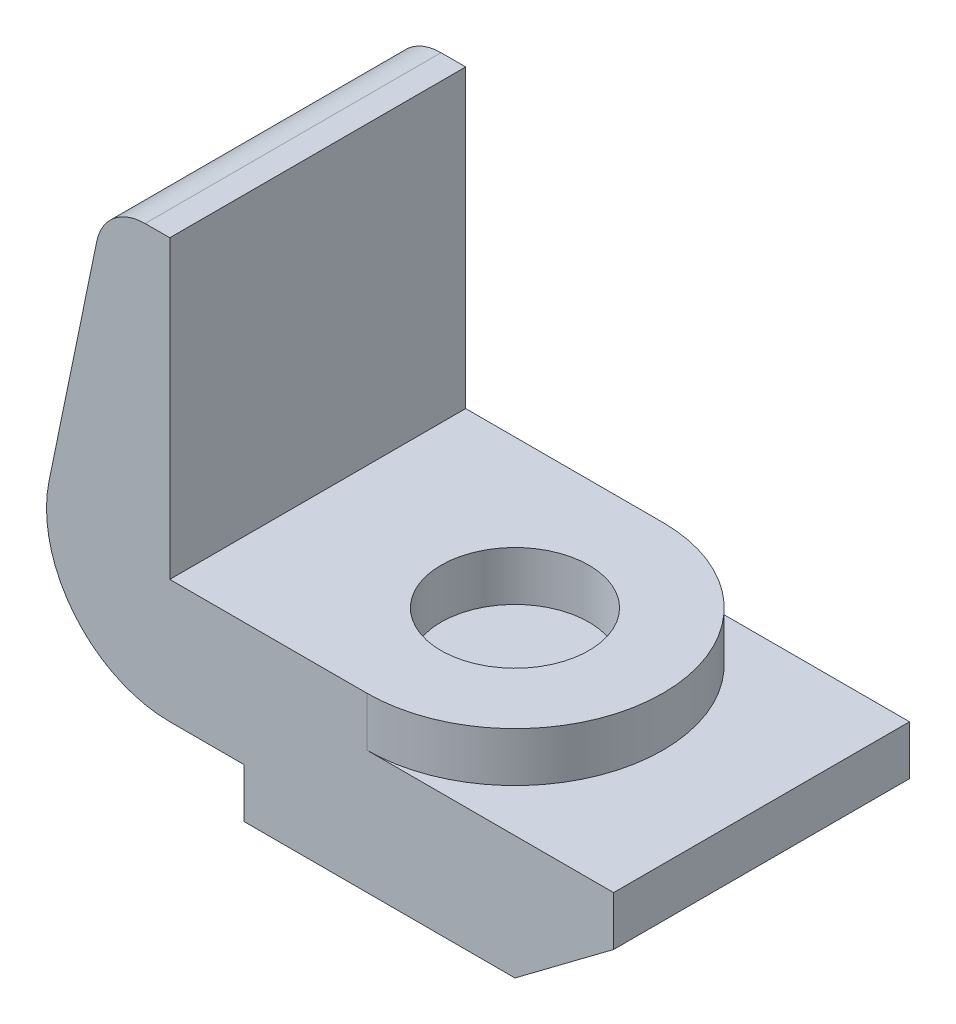
ISO-10303-21;
HEADER;
FILE_DESCRIPTION(('STEP AP214'),'2;1');
FILE_NAME('part.step','',(''),(''),'','','');
FILE_SCHEMA(('AUTOMOTIVE_DESIGN { 1 0 10303 214 1 1 1 1 }'));
ENDSEC;
DATA;
#1=APPLICATION_CONTEXT('core data for automotive mechanical design processes');
#2=APPLICATION_PROTOCOL_DEFINITION('international standard','automotive_design',2000,#1);
#3=PRODUCT_CONTEXT('',#1,'mechanical');
#4=PRODUCT('Part','Part','',(#3));
#5=PRODUCT_RELATED_PRODUCT_CATEGORY('part','',(#4));
#6=PRODUCT_DEFINITION_FORMATION('','',#4);
#7=PRODUCT_DEFINITION_CONTEXT('part definition',#1,'design');
#8=PRODUCT_DEFINITION('design','',#6,#7);
#9=PRODUCT_DEFINITION_SHAPE('','',#8);
#10=(LENGTH_UNIT() NAMED_UNIT(*) SI_UNIT(.MILLI.,.METRE.));
#11=(NAMED_UNIT(*) PLANE_ANGLE_UNIT() SI_UNIT($,.RADIAN.));
#12=(NAMED_UNIT(*) SI_UNIT($,.STERADIAN.) SOLID_ANGLE_UNIT());
#13=UNCERTAINTY_MEASURE_WITH_UNIT(LENGTH_MEASURE(1.E-05),#10,'distance_accuracy_value','');
#14=(GEOMETRIC_REPRESENTATION_CONTEXT(3) GLOBAL_UNCERTAINTY_ASSIGNED_CONTEXT((#13)) GLOBAL_UNIT_ASSIGNED_CONTEXT((#10,
#11,#12)) REPRESENTATION_CONTEXT('',''));
#15=CARTESIAN_POINT('',(0.,0.,0.));
#16=DIRECTION('',(0.,0.,1.));
#17=DIRECTION('',(1.,0.,0.));
#18=AXIS2_PLACEMENT_3D('',#15,#16,#17);
#19=CARTESIAN_POINT('',(0.,0.,76.2));
#20=DIRECTION('',(1.,0.,0.));
#21=DIRECTION('',(0.,0.,-1.));
#22=AXIS2_PLACEMENT_3D('',#19,#20,#21);
#23=PLANE('',#22);
#24=DIRECTION('',(0.,-1.,0.));
#25=VECTOR('',#24,1.);
#26=CARTESIAN_POINT('',(0.,0.,0.));
#27=LINE('',#26,#25);
#28=CARTESIAN_POINT('',(0.,12.7,0.));
#29=VERTEX_POINT('',#28);
#30=CARTESIAN_POINT('',(0.,0.,0.));
#31=VERTEX_POINT('',#30);
#32=EDGE_CURVE('E169',#29,#31,#27,.T.);
#33=ORIENTED_EDGE('',*,*,#32,.T.);
#34=DIRECTION('',(0.,0.,-1.));
#35=VECTOR('',#34,1.);
#36=CARTESIAN_POINT('',(0.,0.,76.2));
#37=LINE('',#36,#35);
#38=CARTESIAN_POINT('',(0.,0.,76.2));
#39=VERTEX_POINT('',#38);
#40=EDGE_CURVE('E11',#39,#31,#37,.T.);
#41=ORIENTED_EDGE('',*,*,#40,.F.);
#42=DIRECTION('',(0.,-1.,0.));
#43=VECTOR('',#42,1.);
#44=CARTESIAN_POINT('',(0.,0.,76.2));
#45=LINE('',#44,#43);
#46=CARTESIAN_POINT('',(0.,12.7,76.2));
#47=VERTEX_POINT('',#46);
#48=EDGE_CURVE('E208',#47,#39,#45,.T.);
#49=ORIENTED_EDGE('',*,*,#48,.F.);
#50=DIRECTION('',(0.,0.,-1.));
#51=VECTOR('',#50,1.);
#52=CARTESIAN_POINT('',(0.,12.7,76.2));
#53=LINE('',#52,#51);
#54=EDGE_CURVE('E165',#47,#29,#53,.T.);
#55=ORIENTED_EDGE('',*,*,#54,.T.);
#56=EDGE_LOOP('',(#33,#41,#49,#55));
#57=FACE_BOUND('',#56,.T.);
#58=ADVANCED_FACE('F39',(#57),#23,.F.);
#59=CARTESIAN_POINT('',(0.,0.,76.2));
#60=DIRECTION('',(0.,1.,0.));
#61=DIRECTION('',(0.,0.,1.));
#62=AXIS2_PLACEMENT_3D('',#59,#60,#61);
#63=PLANE('',#62);
#64=DIRECTION('',(1.,0.,0.));
#65=VECTOR('',#64,1.);
#66=CARTESIAN_POINT('',(0.,0.,0.));
#67=LINE('',#66,#65);
#68=CARTESIAN_POINT('',(69.85,0.,0.));
#69=VERTEX_POINT('',#68);
#70=EDGE_CURVE('E173',#31,#69,#67,.T.);
#71=ORIENTED_EDGE('',*,*,#70,.T.);
#72=DIRECTION('',(0.,0.,-1.));
#73=VECTOR('',#72,1.);
#74=CARTESIAN_POINT('',(69.85,0.,76.2));
#75=LINE('',#74,#73);
#76=CARTESIAN_POINT('',(69.85,0.,76.2));
#77=VERTEX_POINT('',#76);
#78=EDGE_CURVE('E48',#77,#69,#75,.T.);
#79=ORIENTED_EDGE('',*,*,#78,.F.);
#80=DIRECTION('',(1.,0.,0.));
#81=VECTOR('',#80,1.);
#82=CARTESIAN_POINT('',(0.,0.,76.2));
#83=LINE('',#82,#81);
#84=EDGE_CURVE('E112',#39,#77,#83,.T.);
#85=ORIENTED_EDGE('',*,*,#84,.F.);
#86=ORIENTED_EDGE('',*,*,#40,.T.);
#87=EDGE_LOOP('',(#71,#79,#85,#86));
#88=FACE_BOUND('',#87,.T.);
#89=ADVANCED_FACE('F303',(#88),#63,.F.);
#90=CARTESIAN_POINT('',(69.85,0.,76.2));
#91=DIRECTION('',(-0.6,0.8,0.));
#92=DIRECTION('',(-0.8,-0.6,0.));
#93=AXIS2_PLACEMENT_3D('',#90,#91,#92);
#94=PLANE('',#93);
#95=DIRECTION('',(0.8,0.6,0.));
#96=VECTOR('',#95,1.);
#97=CARTESIAN_POINT('',(69.85,0.,0.));
#98=LINE('',#97,#96);
#99=CARTESIAN_POINT('',(95.25,19.05,0.));
#100=VERTEX_POINT('',#99);
#101=EDGE_CURVE('E177',#69,#100,#98,.T.);
#102=ORIENTED_EDGE('',*,*,#101,.T.);
#103=DIRECTION('',(0.,0.,-1.));
#104=VECTOR('',#103,1.);
#105=CARTESIAN_POINT('',(95.25,19.05,76.2));
#106=LINE('',#105,#104);
#107=CARTESIAN_POINT('',(95.25,19.05,76.2));
#108=VERTEX_POINT('',#107);
#109=EDGE_CURVE('E231',#108,#100,#106,.T.);
#110=ORIENTED_EDGE('',*,*,#109,.F.);
#111=DIRECTION('',(0.8,0.6,0.));
#112=VECTOR('',#111,1.);
#113=CARTESIAN_POINT('',(69.85,0.,76.2));
#114=LINE('',#113,#112);
#115=EDGE_CURVE('E241',#77,#108,#114,.T.);
#116=ORIENTED_EDGE('',*,*,#115,.F.);
#117=ORIENTED_EDGE('',*,*,#78,.T.);
#118=EDGE_LOOP('',(#102,#110,#116,#117));
#119=FACE_BOUND('',#118,.T.);
#120=ADVANCED_FACE('F239',(#119),#94,.F.);
#121=CARTESIAN_POINT('',(95.25,19.05,76.2));
#122=DIRECTION('',(-1.,0.,0.));
#123=DIRECTION('',(0.,0.,1.));
#124=AXIS2_PLACEMENT_3D('',#121,#122,#123);
#125=PLANE('',#124);
#126=DIRECTION('',(0.,1.,0.));
#127=VECTOR('',#126,1.);
#128=CARTESIAN_POINT('',(95.25,19.05,0.));
#129=LINE('',#128,#127);
#130=CARTESIAN_POINT('',(95.25,31.75,0.));
#131=VERTEX_POINT('',#130);
#132=EDGE_CURVE('E180',#100,#131,#129,.T.);
#133=ORIENTED_EDGE('',*,*,#132,.T.);
#134=DIRECTION('',(0.,0.,-1.));
#135=VECTOR('',#134,1.);
#136=CARTESIAN_POINT('',(95.25,31.75,76.2));
#137=LINE('',#136,#135);
#138=CARTESIAN_POINT('',(95.25,31.75,76.2));
#139=VERTEX_POINT('',#138);
#140=EDGE_CURVE('E227',#139,#131,#137,.T.);
#141=ORIENTED_EDGE('',*,*,#140,.F.);
#142=DIRECTION('',(0.,1.,0.));
#143=VECTOR('',#142,1.);
#144=CARTESIAN_POINT('',(95.25,19.05,76.2));
#145=LINE('',#144,#143);
#146=EDGE_CURVE('E262',#108,#139,#145,.T.);
#147=ORIENTED_EDGE('',*,*,#146,.F.);
#148=ORIENTED_EDGE('',*,*,#109,.T.);
#149=EDGE_LOOP('',(#133,#141,#147,#148));
#150=FACE_BOUND('',#149,.T.);
#151=ADVANCED_FACE('F250',(#150),#125,.F.);
#152=CARTESIAN_POINT('',(95.25,31.75,76.2));
#153=DIRECTION('',(0.,-1.,0.));
#154=DIRECTION('',(1.,0.,0.));
#155=AXIS2_PLACEMENT_3D('',#152,#153,#154);
#156=PLANE('',#155);
#157=CARTESIAN_POINT('',(31.75,31.75,38.1));
#158=DIRECTION('',(0.,1.,0.));
#159=DIRECTION('',(-1.,0.,0.));
#160=AXIS2_PLACEMENT_3D('',#157,#158,#159);
#161=CIRCLE('',#160,38.1);
#162=CARTESIAN_POINT('',(31.75,31.75,76.2));
#163=VERTEX_POINT('',#162);
#164=CARTESIAN_POINT('',(31.75,31.75,0.));
#165=VERTEX_POINT('',#164);
#166=EDGE_CURVE('E258',#163,#165,#161,.T.);
#167=ORIENTED_EDGE('',*,*,#166,.F.);
#168=DIRECTION('',(-1.,0.,0.));
#169=VECTOR('',#168,1.);
#170=CARTESIAN_POINT('',(95.25,31.75,76.2));
#171=LINE('',#170,#169);
#172=EDGE_CURVE('E256',#139,#163,#171,.T.);
#173=ORIENTED_EDGE('',*,*,#172,.F.);
#174=ORIENTED_EDGE('',*,*,#140,.T.);
#175=DIRECTION('',(-1.,0.,0.));
#176=VECTOR('',#175,1.);
#177=CARTESIAN_POINT('',(95.25,31.75,0.));
#178=LINE('',#177,#176);
#179=EDGE_CURVE('E183',#131,#165,#178,.T.);
#180=ORIENTED_EDGE('',*,*,#179,.T.);
#181=EDGE_LOOP('',(#167,#173,#174,#180));
#182=FACE_BOUND('',#181,.T.);
#183=ADVANCED_FACE('F254',(#182),#156,.F.);
#184=CARTESIAN_POINT('',(31.75,44.45,76.2));
#185=DIRECTION('',(0.,-1.,0.));
#186=DIRECTION('',(1.,0.,0.));
#187=AXIS2_PLACEMENT_3D('',#184,#185,#186);
#188=PLANE('',#187);
#189=CARTESIAN_POINT('',(31.75,44.45,38.1));
#190=DIRECTION('',(0.,1.,0.));
#191=DIRECTION('',(-1.,0.,0.));
#192=AXIS2_PLACEMENT_3D('',#189,#190,#191);
#193=CIRCLE('',#192,19.05);
#194=CARTESIAN_POINT('',(12.7,44.45,38.1));
#195=VERTEX_POINT('',#194);
#196=EDGE_CURVE('E406',#195,#195,#193,.T.);
#197=ORIENTED_EDGE('',*,*,#196,.F.);
#198=EDGE_LOOP('',(#197));
#199=FACE_BOUND('',#198,.T.);
#200=DIRECTION('',(-1.,0.,0.));
#201=VECTOR('',#200,1.);
#202=CARTESIAN_POINT('',(31.75,44.45,76.2));
#203=LINE('',#202,#201);
#204=CARTESIAN_POINT('',(31.75,44.45,76.2));
#205=VERTEX_POINT('',#204);
#206=CARTESIAN_POINT('',(-19.05,44.45,76.2));
#207=VERTEX_POINT('',#206);
#208=EDGE_CURVE('E266',#205,#207,#203,.T.);
#209=ORIENTED_EDGE('',*,*,#208,.F.);
#210=CARTESIAN_POINT('',(31.75,44.45,38.1));
#211=DIRECTION('',(0.,-1.,0.));
#212=DIRECTION('',(1.,0.,0.));
#213=AXIS2_PLACEMENT_3D('',#210,#211,#212);
#214=CIRCLE('',#213,38.1);
#215=CARTESIAN_POINT('',(31.75,44.45,0.));
#216=VERTEX_POINT('',#215);
#217=EDGE_CURVE('E174',#216,#205,#214,.T.);
#218=ORIENTED_EDGE('',*,*,#217,.F.);
#219=DIRECTION('',(-1.,0.,0.));
#220=VECTOR('',#219,1.);
#221=CARTESIAN_POINT('',(31.75,44.45,0.));
#222=LINE('',#221,#220);
#223=CARTESIAN_POINT('',(-19.05,44.45,0.));
#224=VERTEX_POINT('',#223);
#225=EDGE_CURVE('E190',#216,#224,#222,.T.);
#226=ORIENTED_EDGE('',*,*,#225,.T.);
#227=DIRECTION('',(0.,0.,-1.));
#228=VECTOR('',#227,1.);
#229=CARTESIAN_POINT('',(-19.05,44.45,76.2));
#230=LINE('',#229,#228);
#231=EDGE_CURVE('E223',#207,#224,#230,.T.);
#232=ORIENTED_EDGE('',*,*,#231,.F.);
#233=EDGE_LOOP('',(#209,#218,#226,#232));
#234=FACE_BOUND('',#233,.T.);
#235=ADVANCED_FACE('F316',(#199,#234),#188,.F.);
#236=CARTESIAN_POINT('',(-19.05,44.45,76.2));
#237=DIRECTION('',(-1.,0.,0.));
#238=DIRECTION('',(0.,-1.,0.));
#239=AXIS2_PLACEMENT_3D('',#236,#237,#238);
#240=PLANE('',#239);
#241=DIRECTION('',(0.,1.,0.));
#242=VECTOR('',#241,1.);
#243=CARTESIAN_POINT('',(-19.05,44.45,0.));
#244=LINE('',#243,#242);
#245=CARTESIAN_POINT('',(-19.05,120.65,0.));
#246=VERTEX_POINT('',#245);
#247=EDGE_CURVE('E193',#224,#246,#244,.T.);
#248=ORIENTED_EDGE('',*,*,#247,.T.);
#249=DIRECTION('',(0.,0.,-1.));
#250=VECTOR('',#249,1.);
#251=CARTESIAN_POINT('',(-19.05,120.65,76.2));
#252=LINE('',#251,#250);
#253=CARTESIAN_POINT('',(-19.05,120.65,76.2));
#254=VERTEX_POINT('',#253);
#255=EDGE_CURVE('E219',#254,#246,#252,.T.);
#256=ORIENTED_EDGE('',*,*,#255,.F.);
#257=DIRECTION('',(0.,1.,0.));
#258=VECTOR('',#257,1.);
#259=CARTESIAN_POINT('',(-19.05,44.45,76.2));
#260=LINE('',#259,#258);
#261=EDGE_CURVE('E273',#207,#254,#260,.T.);
#262=ORIENTED_EDGE('',*,*,#261,.F.);
#263=ORIENTED_EDGE('',*,*,#231,.T.);
#264=EDGE_LOOP('',(#248,#256,#262,#263));
#265=FACE_BOUND('',#264,.T.);
#266=ADVANCED_FACE('F319',(#265),#240,.F.);
#267=CARTESIAN_POINT('',(-19.05,120.65,76.2));
#268=DIRECTION('',(0.,-1.,0.));
#269=DIRECTION('',(0.,0.,-1.));
#270=AXIS2_PLACEMENT_3D('',#267,#268,#269);
#271=PLANE('',#270);
#272=DIRECTION('',(-1.,0.,0.));
#273=VECTOR('',#272,1.);
#274=CARTESIAN_POINT('',(-19.05,120.65,0.));
#275=LINE('',#274,#273);
#276=CARTESIAN_POINT('',(-25.4,120.65,0.));
#277=VERTEX_POINT('',#276);
#278=EDGE_CURVE('E196',#246,#277,#275,.T.);
#279=ORIENTED_EDGE('',*,*,#278,.T.);
#280=DIRECTION('',(0.,0.,-1.));
#281=VECTOR('',#280,1.);
#282=CARTESIAN_POINT('',(-25.4,120.65,76.2));
#283=LINE('',#282,#281);
#284=CARTESIAN_POINT('',(-25.4,120.65,76.2));
#285=VERTEX_POINT('',#284);
#286=EDGE_CURVE('E215',#285,#277,#283,.T.);
#287=ORIENTED_EDGE('',*,*,#286,.F.);
#288=DIRECTION('',(-1.,0.,0.));
#289=VECTOR('',#288,1.);
#290=CARTESIAN_POINT('',(-19.05,120.65,76.2));
#291=LINE('',#290,#289);
#292=EDGE_CURVE('E276',#254,#285,#291,.T.);
#293=ORIENTED_EDGE('',*,*,#292,.F.);
#294=ORIENTED_EDGE('',*,*,#255,.T.);
#295=EDGE_LOOP('',(#279,#287,#293,#294));
#296=FACE_BOUND('',#295,.T.);
#297=ADVANCED_FACE('F284',(#296),#271,.F.);
#298=CARTESIAN_POINT('',(-25.4,107.95,76.2));
#299=DIRECTION('',(0.,0.,-1.));
#300=DIRECTION('',(-1.,0.,0.));
#301=AXIS2_PLACEMENT_3D('',#298,#299,#300);
#302=CYLINDRICAL_SURFACE('',#301,12.7);
#303=CARTESIAN_POINT('',(-25.4,107.95,0.));
#304=DIRECTION('',(0.,0.,1.));
#305=DIRECTION('',(1.,0.,0.));
#306=AXIS2_PLACEMENT_3D('',#303,#304,#305);
#307=CIRCLE('',#306,12.7);
#308=CARTESIAN_POINT('',(-37.8380317516973,110.51619682483,0.));
#309=VERTEX_POINT('',#308);
#310=EDGE_CURVE('E199',#277,#309,#307,.T.);
#311=ORIENTED_EDGE('',*,*,#310,.T.);
#312=DIRECTION('',(0.,0.,-1.));
#313=VECTOR('',#312,1.);
#314=CARTESIAN_POINT('',(-37.8380317516973,110.51619682483,76.2));
#315=LINE('',#314,#313);
#316=CARTESIAN_POINT('',(-37.8380317516973,110.51619682483,76.2));
#317=VERTEX_POINT('',#316);
#318=EDGE_CURVE('E158',#317,#309,#315,.T.);
#319=ORIENTED_EDGE('',*,*,#318,.F.);
#320=CARTESIAN_POINT('',(-25.4,107.95,76.2));
#321=DIRECTION('',(0.,0.,1.));
#322=DIRECTION('',(1.,0.,0.));
#323=AXIS2_PLACEMENT_3D('',#320,#321,#322);
#324=CIRCLE('',#323,12.7);
#325=EDGE_CURVE('E147',#285,#317,#324,.T.);
#326=ORIENTED_EDGE('',*,*,#325,.F.);
#327=ORIENTED_EDGE('',*,*,#286,.T.);
#328=EDGE_LOOP('',(#311,#319,#326,#327));
#329=FACE_BOUND('',#328,.T.);
#330=ADVANCED_FACE('F288',(#329),#302,.T.);
#331=CARTESIAN_POINT('',(-37.8380317516974,110.51619682483,76.2));
#332=DIRECTION('',(0.979372578873806,-0.202062742112619,0.));
#333=DIRECTION('',(0.202062742112619,0.979372578873806,0.));
#334=AXIS2_PLACEMENT_3D('',#331,#332,#333);
#335=PLANE('',#334);
#336=DIRECTION('',(-0.202062742112619,-0.979372578873806,0.));
#337=VECTOR('',#336,1.);
#338=CARTESIAN_POINT('',(-37.8380317516974,110.51619682483,0.));
#339=LINE('',#338,#337);
#340=CARTESIAN_POINT('',(-50.1450793792433,50.8654920620756,0.));
#341=VERTEX_POINT('',#340);
#342=EDGE_CURVE('E156',#309,#341,#339,.T.);
#343=ORIENTED_EDGE('',*,*,#342,.T.);
#344=DIRECTION('',(0.,0.,-1.));
#345=VECTOR('',#344,1.);
#346=CARTESIAN_POINT('',(-50.1450793792433,50.8654920620756,76.2));
#347=LINE('',#346,#345);
#348=CARTESIAN_POINT('',(-50.1450793792433,50.8654920620756,76.2));
#349=VERTEX_POINT('',#348);
#350=EDGE_CURVE('E153',#349,#341,#347,.T.);
#351=ORIENTED_EDGE('',*,*,#350,.F.);
#352=DIRECTION('',(-0.202062742112619,-0.979372578873806,0.));
#353=VECTOR('',#352,1.);
#354=CARTESIAN_POINT('',(-37.8380317516974,110.51619682483,76.2));
#355=LINE('',#354,#353);
#356=EDGE_CURVE('E141',#317,#349,#355,.T.);
#357=ORIENTED_EDGE('',*,*,#356,.F.);
#358=ORIENTED_EDGE('',*,*,#318,.T.);
#359=EDGE_LOOP('',(#343,#351,#357,#358));
#360=FACE_BOUND('',#359,.T.);
#361=ADVANCED_FACE('F154',(#360),#335,.F.);
#362=CARTESIAN_POINT('',(-19.05,44.45,76.2));
#363=DIRECTION('',(0.,0.,-1.));
#364=DIRECTION('',(-1.,0.,0.));
#365=AXIS2_PLACEMENT_3D('',#362,#363,#364);
#366=CYLINDRICAL_SURFACE('',#365,31.75);
#367=CARTESIAN_POINT('',(-19.05,44.45,0.));
#368=DIRECTION('',(0.,0.,1.));
#369=DIRECTION('',(1.,0.,0.));
#370=AXIS2_PLACEMENT_3D('',#367,#368,#369);
#371=CIRCLE('',#370,31.75);
#372=CARTESIAN_POINT('',(-19.05,12.7,0.));
#373=VERTEX_POINT('',#372);
#374=EDGE_CURVE('E98',#341,#373,#371,.T.);
#375=ORIENTED_EDGE('',*,*,#374,.T.);
#376=DIRECTION('',(0.,0.,-1.));
#377=VECTOR('',#376,1.);
#378=CARTESIAN_POINT('',(-19.05,12.7,76.2));
#379=LINE('',#378,#377);
#380=CARTESIAN_POINT('',(-19.05,12.7,76.2));
#381=VERTEX_POINT('',#380);
#382=EDGE_CURVE('E159',#381,#373,#379,.T.);
#383=ORIENTED_EDGE('',*,*,#382,.F.);
#384=CARTESIAN_POINT('',(-19.05,44.45,76.2));
#385=DIRECTION('',(0.,0.,1.));
#386=DIRECTION('',(1.,0.,0.));
#387=AXIS2_PLACEMENT_3D('',#384,#385,#386);
#388=CIRCLE('',#387,31.75);
#389=EDGE_CURVE('E145',#349,#381,#388,.T.);
#390=ORIENTED_EDGE('',*,*,#389,.F.);
#391=ORIENTED_EDGE('',*,*,#350,.T.);
#392=EDGE_LOOP('',(#375,#383,#390,#391));
#393=FACE_BOUND('',#392,.T.);
#394=ADVANCED_FACE('F161',(#393),#366,.T.);
#395=CARTESIAN_POINT('',(0.,12.7,76.2));
#396=DIRECTION('',(0.,1.,0.));
#397=DIRECTION('',(-1.,0.,0.));
#398=AXIS2_PLACEMENT_3D('',#395,#396,#397);
#399=PLANE('',#398);
#400=DIRECTION('',(1.,0.,0.));
#401=VECTOR('',#400,1.);
#402=CARTESIAN_POINT('',(0.,12.7,0.));
#403=LINE('',#402,#401);
#404=EDGE_CURVE('E104',#373,#29,#403,.T.);
#405=ORIENTED_EDGE('',*,*,#404,.T.);
#406=ORIENTED_EDGE('',*,*,#54,.F.);
#407=DIRECTION('',(1.,0.,0.));
#408=VECTOR('',#407,1.);
#409=CARTESIAN_POINT('',(0.,12.7,76.2));
#410=LINE('',#409,#408);
#411=EDGE_CURVE('E56',#381,#47,#410,.T.);
#412=ORIENTED_EDGE('',*,*,#411,.F.);
#413=ORIENTED_EDGE('',*,*,#382,.T.);
#414=EDGE_LOOP('',(#405,#406,#412,#413));
#415=FACE_BOUND('',#414,.T.);
#416=ADVANCED_FACE('F292',(#415),#399,.F.);
#417=CARTESIAN_POINT('',(-19.05,44.45,76.2));
#418=DIRECTION('',(0.,0.,1.));
#419=DIRECTION('',(1.,0.,0.));
#420=AXIS2_PLACEMENT_3D('',#417,#418,#419);
#421=PLANE('',#420);
#422=ORIENTED_EDGE('',*,*,#48,.T.);
#423=ORIENTED_EDGE('',*,*,#84,.T.);
#424=ORIENTED_EDGE('',*,*,#115,.T.);
#425=ORIENTED_EDGE('',*,*,#146,.T.);
#426=ORIENTED_EDGE('',*,*,#172,.T.);
#427=DIRECTION('',(0.,1.,0.));
#428=VECTOR('',#427,1.);
#429=CARTESIAN_POINT('',(31.75,31.75,76.2));
#430=LINE('',#429,#428);
#431=EDGE_CURVE('E261',#163,#205,#430,.T.);
#432=ORIENTED_EDGE('',*,*,#431,.T.);
#433=ORIENTED_EDGE('',*,*,#208,.T.);
#434=ORIENTED_EDGE('',*,*,#261,.T.);
#435=ORIENTED_EDGE('',*,*,#292,.T.);
#436=ORIENTED_EDGE('',*,*,#325,.T.);
#437=ORIENTED_EDGE('',*,*,#356,.T.);
#438=ORIENTED_EDGE('',*,*,#389,.T.);
#439=ORIENTED_EDGE('',*,*,#411,.T.);
#440=EDGE_LOOP('',(#422,#423,#424,#425,#426,#432,#433,#434,#435,#436,#437,#438,#439));
#441=FACE_BOUND('',#440,.T.);
#442=ADVANCED_FACE('F143',(#441),#421,.T.);
#443=CARTESIAN_POINT('',(-19.05,44.45,0.));
#444=DIRECTION('',(0.,0.,1.));
#445=DIRECTION('',(1.,0.,0.));
#446=AXIS2_PLACEMENT_3D('',#443,#444,#445);
#447=PLANE('',#446);
#448=ORIENTED_EDGE('',*,*,#32,.F.);
#449=ORIENTED_EDGE('',*,*,#404,.F.);
#450=ORIENTED_EDGE('',*,*,#374,.F.);
#451=ORIENTED_EDGE('',*,*,#342,.F.);
#452=ORIENTED_EDGE('',*,*,#310,.F.);
#453=ORIENTED_EDGE('',*,*,#278,.F.);
#454=ORIENTED_EDGE('',*,*,#247,.F.);
#455=ORIENTED_EDGE('',*,*,#225,.F.);
#456=DIRECTION('',(0.,1.,0.));
#457=VECTOR('',#456,1.);
#458=CARTESIAN_POINT('',(31.75,31.75,0.));
#459=LINE('',#458,#457);
#460=EDGE_CURVE('E186',#165,#216,#459,.T.);
#461=ORIENTED_EDGE('',*,*,#460,.F.);
#462=ORIENTED_EDGE('',*,*,#179,.F.);
#463=ORIENTED_EDGE('',*,*,#132,.F.);
#464=ORIENTED_EDGE('',*,*,#101,.F.);
#465=ORIENTED_EDGE('',*,*,#70,.F.);
#466=EDGE_LOOP('',(#448,#449,#450,#451,#452,#453,#454,#455,#461,#462,#463,#464,#465));
#467=FACE_BOUND('',#466,.T.);
#468=ADVANCED_FACE('F245',(#467),#447,.F.);
#469=CARTESIAN_POINT('',(31.75,152.21307345283,38.1));
#470=DIRECTION('',(0.,-1.,0.));
#471=DIRECTION('',(1.,0.,0.));
#472=AXIS2_PLACEMENT_3D('',#469,#470,#471);
#473=CYLINDRICAL_SURFACE('',#472,38.1);
#474=ORIENTED_EDGE('',*,*,#431,.F.);
#475=ORIENTED_EDGE('',*,*,#166,.T.);
#476=ORIENTED_EDGE('',*,*,#460,.T.);
#477=ORIENTED_EDGE('',*,*,#217,.T.);
#478=EDGE_LOOP('',(#474,#475,#476,#477));
#479=FACE_BOUND('',#478,.T.);
#480=ADVANCED_FACE('F364',(#479),#473,.T.);
#481=CARTESIAN_POINT('',(31.75,31.75,38.1));
#482=DIRECTION('',(0.,1.,0.));
#483=DIRECTION('',(-1.,0.,0.));
#484=AXIS2_PLACEMENT_3D('',#481,#482,#483);
#485=CYLINDRICAL_SURFACE('',#484,19.05);
#486=CARTESIAN_POINT('',(31.75,31.75,38.1));
#487=DIRECTION('',(0.,1.,0.));
#488=DIRECTION('',(-1.,0.,0.));
#489=AXIS2_PLACEMENT_3D('',#486,#487,#488);
#490=CIRCLE('',#489,19.05);
#491=CARTESIAN_POINT('',(12.7,31.75,38.1));
#492=VERTEX_POINT('',#491);
#493=EDGE_CURVE('E404',#492,#492,#490,.T.);
#494=ORIENTED_EDGE('',*,*,#493,.F.);
#495=EDGE_LOOP('',(#494));
#496=FACE_BOUND('',#495,.T.);
#497=ORIENTED_EDGE('',*,*,#196,.T.);
#498=EDGE_LOOP('',(#497));
#499=FACE_BOUND('',#498,.T.);
#500=ADVANCED_FACE('F373',(#496,#499),#485,.F.);
#501=CARTESIAN_POINT('',(31.75,31.75,38.1));
#502=DIRECTION('',(0.,1.,0.));
#503=DIRECTION('',(-1.,0.,0.));
#504=AXIS2_PLACEMENT_3D('',#501,#502,#503);
#505=PLANE('',#504);
#506=ORIENTED_EDGE('',*,*,#493,.T.);
#507=EDGE_LOOP('',(#506));
#508=FACE_BOUND('',#507,.T.);
#509=ADVANCED_FACE('F388',(#508),#505,.T.);
#510=CLOSED_SHELL('',(#58,#89,#120,#151,#183,#235,#266,#297,#330,#361,#394,#416,#442,#468,#480,
#500,#509));
#511=MANIFOLD_SOLID_BREP('B2',#510);
#512=ADVANCED_BREP_SHAPE_REPRESENTATION('',(#18,#511),#14);
#513=SHAPE_DEFINITION_REPRESENTATION(#9,#512);
ENDSEC;
END-ISO-10303-21;
